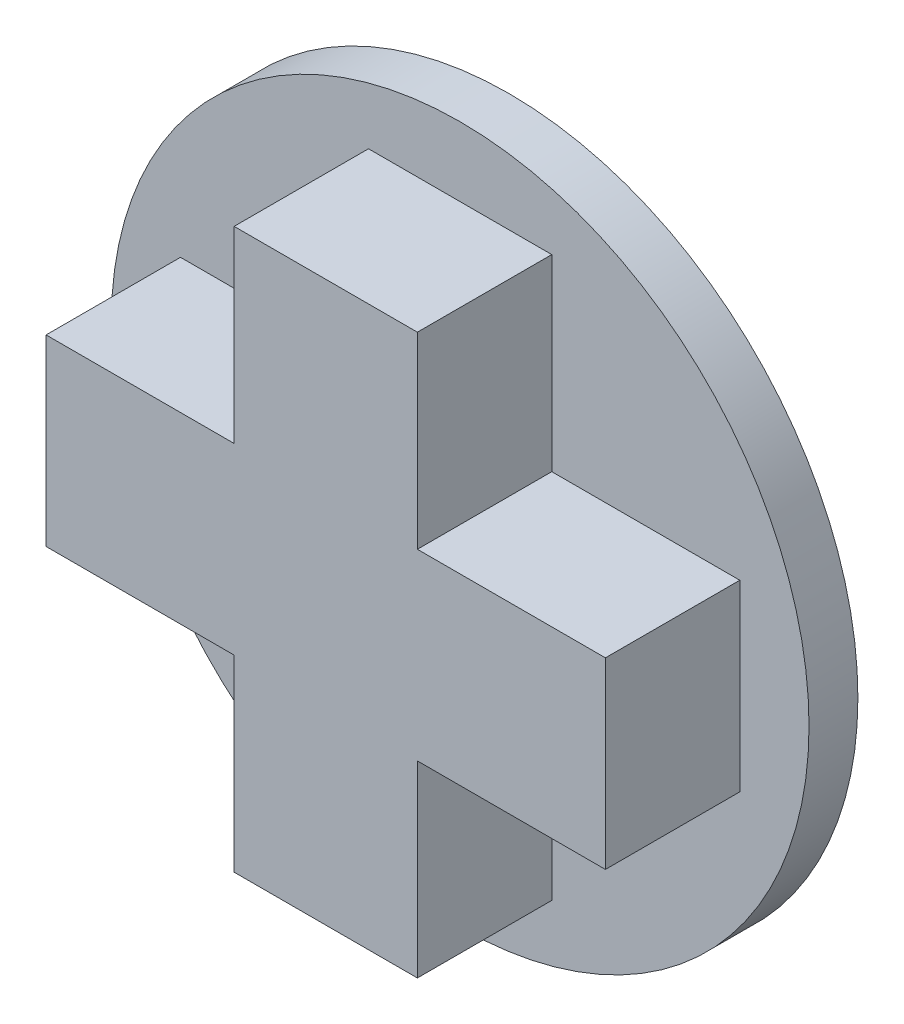
ISO-10303-21;
HEADER;
FILE_DESCRIPTION(('STEP AP214'),'2;1');
FILE_NAME('part.step','',(''),(''),'','','');
FILE_SCHEMA(('AUTOMOTIVE_DESIGN { 1 0 10303 214 1 1 1 1 }'));
ENDSEC;
DATA;
#1=APPLICATION_CONTEXT('core data for automotive mechanical design processes');
#2=APPLICATION_PROTOCOL_DEFINITION('international standard','automotive_design',2000,#1);
#3=PRODUCT_CONTEXT('',#1,'mechanical');
#4=PRODUCT('Part','Part','',(#3));
#5=PRODUCT_RELATED_PRODUCT_CATEGORY('part','',(#4));
#6=PRODUCT_DEFINITION_FORMATION('','',#4);
#7=PRODUCT_DEFINITION_CONTEXT('part definition',#1,'design');
#8=PRODUCT_DEFINITION('design','',#6,#7);
#9=PRODUCT_DEFINITION_SHAPE('','',#8);
#10=(LENGTH_UNIT() NAMED_UNIT(*) SI_UNIT(.MILLI.,.METRE.));
#11=(NAMED_UNIT(*) PLANE_ANGLE_UNIT() SI_UNIT($,.RADIAN.));
#12=(NAMED_UNIT(*) SI_UNIT($,.STERADIAN.) SOLID_ANGLE_UNIT());
#13=UNCERTAINTY_MEASURE_WITH_UNIT(LENGTH_MEASURE(1.E-05),#10,'distance_accuracy_value','');
#14=(GEOMETRIC_REPRESENTATION_CONTEXT(3) GLOBAL_UNCERTAINTY_ASSIGNED_CONTEXT((#13)) GLOBAL_UNIT_ASSIGNED_CONTEXT((#10,
#11,#12)) REPRESENTATION_CONTEXT('',''));
#15=CARTESIAN_POINT('',(0.,0.,0.));
#16=DIRECTION('',(0.,0.,1.));
#17=DIRECTION('',(1.,0.,0.));
#18=AXIS2_PLACEMENT_3D('',#15,#16,#17);
#19=CARTESIAN_POINT('',(0.,0.,1.8));
#20=DIRECTION('',(0.,0.,1.));
#21=DIRECTION('',(1.,0.,0.));
#22=AXIS2_PLACEMENT_3D('',#19,#20,#21);
#23=PLANE('',#22);
#24=CARTESIAN_POINT('',(0.,0.,1.8));
#25=DIRECTION('',(0.,0.,1.));
#26=DIRECTION('',(1.,0.,0.));
#27=AXIS2_PLACEMENT_3D('',#24,#25,#26);
#28=CIRCLE('',#27,12.85);
#29=CARTESIAN_POINT('',(12.85,0.,1.8));
#30=VERTEX_POINT('',#29);
#31=EDGE_CURVE('E204',#30,#30,#28,.T.);
#32=ORIENTED_EDGE('',*,*,#31,.T.);
#33=EDGE_LOOP('',(#32));
#34=FACE_BOUND('',#33,.T.);
#35=DIRECTION('',(-1.,0.,0.));
#36=VECTOR('',#35,1.);
#37=CARTESIAN_POINT('',(-3.375,10.3,1.8));
#38=LINE('',#37,#36);
#39=CARTESIAN_POINT('',(3.375,10.3,1.8));
#40=VERTEX_POINT('',#39);
#41=CARTESIAN_POINT('',(-3.375,10.3,1.8));
#42=VERTEX_POINT('',#41);
#43=EDGE_CURVE('E156',#40,#42,#38,.T.);
#44=ORIENTED_EDGE('',*,*,#43,.F.);
#45=DIRECTION('',(0.,1.,0.));
#46=VECTOR('',#45,1.);
#47=CARTESIAN_POINT('',(3.375,3.375,1.8));
#48=LINE('',#47,#46);
#49=CARTESIAN_POINT('',(3.375,3.375,1.8));
#50=VERTEX_POINT('',#49);
#51=EDGE_CURVE('E153',#50,#40,#48,.T.);
#52=ORIENTED_EDGE('',*,*,#51,.F.);
#53=DIRECTION('',(-1.,0.,0.));
#54=VECTOR('',#53,1.);
#55=CARTESIAN_POINT('',(3.375,3.375,1.8));
#56=LINE('',#55,#54);
#57=CARTESIAN_POINT('',(10.3,3.375,1.8));
#58=VERTEX_POINT('',#57);
#59=EDGE_CURVE('E94',#58,#50,#56,.T.);
#60=ORIENTED_EDGE('',*,*,#59,.F.);
#61=DIRECTION('',(0.,1.,0.));
#62=VECTOR('',#61,1.);
#63=CARTESIAN_POINT('',(10.3,-3.375,1.8));
#64=LINE('',#63,#62);
#65=CARTESIAN_POINT('',(10.3,-3.375,1.8));
#66=VERTEX_POINT('',#65);
#67=EDGE_CURVE('E173',#66,#58,#64,.T.);
#68=ORIENTED_EDGE('',*,*,#67,.F.);
#69=DIRECTION('',(1.,0.,0.));
#70=VECTOR('',#69,1.);
#71=CARTESIAN_POINT('',(3.375,-3.375,1.8));
#72=LINE('',#71,#70);
#73=CARTESIAN_POINT('',(3.375,-3.375,1.8));
#74=VERTEX_POINT('',#73);
#75=EDGE_CURVE('E142',#74,#66,#72,.T.);
#76=ORIENTED_EDGE('',*,*,#75,.F.);
#77=DIRECTION('',(0.,1.,0.));
#78=VECTOR('',#77,1.);
#79=CARTESIAN_POINT('',(3.375,-10.3,1.8));
#80=LINE('',#79,#78);
#81=CARTESIAN_POINT('',(3.375,-10.3,1.8));
#82=VERTEX_POINT('',#81);
#83=EDGE_CURVE('E170',#82,#74,#80,.T.);
#84=ORIENTED_EDGE('',*,*,#83,.F.);
#85=DIRECTION('',(1.,0.,0.));
#86=VECTOR('',#85,1.);
#87=CARTESIAN_POINT('',(-3.375,-10.3,1.8));
#88=LINE('',#87,#86);
#89=CARTESIAN_POINT('',(-3.375,-10.3,1.8));
#90=VERTEX_POINT('',#89);
#91=EDGE_CURVE('E168',#90,#82,#88,.T.);
#92=ORIENTED_EDGE('',*,*,#91,.F.);
#93=DIRECTION('',(0.,-1.,0.));
#94=VECTOR('',#93,1.);
#95=CARTESIAN_POINT('',(-3.375,-10.3,1.8));
#96=LINE('',#95,#94);
#97=CARTESIAN_POINT('',(-3.375,-3.375,1.8));
#98=VERTEX_POINT('',#97);
#99=EDGE_CURVE('E166',#98,#90,#96,.T.);
#100=ORIENTED_EDGE('',*,*,#99,.F.);
#101=DIRECTION('',(1.,0.,0.));
#102=VECTOR('',#101,1.);
#103=CARTESIAN_POINT('',(-10.3,-3.375,1.8));
#104=LINE('',#103,#102);
#105=CARTESIAN_POINT('',(-10.3,-3.375,1.8));
#106=VERTEX_POINT('',#105);
#107=EDGE_CURVE('E164',#106,#98,#104,.T.);
#108=ORIENTED_EDGE('',*,*,#107,.F.);
#109=DIRECTION('',(0.,-1.,0.));
#110=VECTOR('',#109,1.);
#111=CARTESIAN_POINT('',(-10.3,-3.375,1.8));
#112=LINE('',#111,#110);
#113=CARTESIAN_POINT('',(-10.3,3.375,1.8));
#114=VERTEX_POINT('',#113);
#115=EDGE_CURVE('E162',#114,#106,#112,.T.);
#116=ORIENTED_EDGE('',*,*,#115,.F.);
#117=DIRECTION('',(-1.,0.,0.));
#118=VECTOR('',#117,1.);
#119=CARTESIAN_POINT('',(-10.3,3.375,1.8));
#120=LINE('',#119,#118);
#121=CARTESIAN_POINT('',(-3.375,3.375,1.8));
#122=VERTEX_POINT('',#121);
#123=EDGE_CURVE('E160',#122,#114,#120,.T.);
#124=ORIENTED_EDGE('',*,*,#123,.F.);
#125=DIRECTION('',(0.,-1.,0.));
#126=VECTOR('',#125,1.);
#127=CARTESIAN_POINT('',(-3.375,3.375,1.8));
#128=LINE('',#127,#126);
#129=EDGE_CURVE('E158',#42,#122,#128,.T.);
#130=ORIENTED_EDGE('',*,*,#129,.F.);
#131=EDGE_LOOP('',(#44,#52,#60,#68,#76,#84,#92,#100,#108,#116,#124,#130));
#132=FACE_BOUND('',#131,.T.);
#133=ADVANCED_FACE('F33',(#34,#132),#23,.T.);
#134=CARTESIAN_POINT('',(0.,0.,1.8));
#135=DIRECTION('',(0.,0.,-1.));
#136=DIRECTION('',(-1.,0.,0.));
#137=AXIS2_PLACEMENT_3D('',#134,#135,#136);
#138=CYLINDRICAL_SURFACE('',#137,12.85);
#139=ORIENTED_EDGE('',*,*,#31,.F.);
#140=EDGE_LOOP('',(#139));
#141=FACE_BOUND('',#140,.T.);
#142=CARTESIAN_POINT('',(0.,0.,0.));
#143=DIRECTION('',(0.,0.,1.));
#144=DIRECTION('',(1.,0.,0.));
#145=AXIS2_PLACEMENT_3D('',#142,#143,#144);
#146=CIRCLE('',#145,12.85);
#147=CARTESIAN_POINT('',(12.85,0.,0.));
#148=VERTEX_POINT('',#147);
#149=EDGE_CURVE('E203',#148,#148,#146,.T.);
#150=ORIENTED_EDGE('',*,*,#149,.T.);
#151=EDGE_LOOP('',(#150));
#152=FACE_BOUND('',#151,.T.);
#153=ADVANCED_FACE('F225',(#141,#152),#138,.T.);
#154=CARTESIAN_POINT('',(0.,0.,0.));
#155=DIRECTION('',(0.,0.,1.));
#156=DIRECTION('',(1.,0.,0.));
#157=AXIS2_PLACEMENT_3D('',#154,#155,#156);
#158=PLANE('',#157);
#159=CARTESIAN_POINT('',(0.,0.,0.));
#160=DIRECTION('',(0.,0.,1.));
#161=DIRECTION('',(1.,0.,0.));
#162=AXIS2_PLACEMENT_3D('',#159,#160,#161);
#163=CIRCLE('',#162,2.65);
#164=CARTESIAN_POINT('',(2.65,0.,0.));
#165=VERTEX_POINT('',#164);
#166=EDGE_CURVE('E207',#165,#165,#163,.F.);
#167=ORIENTED_EDGE('',*,*,#166,.F.);
#168=EDGE_LOOP('',(#167));
#169=FACE_BOUND('',#168,.T.);
#170=ORIENTED_EDGE('',*,*,#149,.F.);
#171=EDGE_LOOP('',(#170));
#172=FACE_BOUND('',#171,.T.);
#173=ADVANCED_FACE('F231',(#169,#172),#158,.F.);
#174=CARTESIAN_POINT('',(3.375,3.375,6.75));
#175=DIRECTION('',(-1.,0.,0.));
#176=DIRECTION('',(0.,0.,1.));
#177=AXIS2_PLACEMENT_3D('',#174,#175,#176);
#178=PLANE('',#177);
#179=ORIENTED_EDGE('',*,*,#51,.T.);
#180=DIRECTION('',(0.,0.,-1.));
#181=VECTOR('',#180,1.);
#182=CARTESIAN_POINT('',(3.375,10.3,6.75));
#183=LINE('',#182,#181);
#184=CARTESIAN_POINT('',(3.375,10.3,6.75));
#185=VERTEX_POINT('',#184);
#186=EDGE_CURVE('E201',#185,#40,#183,.T.);
#187=ORIENTED_EDGE('',*,*,#186,.F.);
#188=DIRECTION('',(0.,1.,0.));
#189=VECTOR('',#188,1.);
#190=CARTESIAN_POINT('',(3.375,3.375,6.75));
#191=LINE('',#190,#189);
#192=CARTESIAN_POINT('',(3.375,3.375,6.75));
#193=VERTEX_POINT('',#192);
#194=EDGE_CURVE('E176',#193,#185,#191,.T.);
#195=ORIENTED_EDGE('',*,*,#194,.F.);
#196=DIRECTION('',(0.,0.,-1.));
#197=VECTOR('',#196,1.);
#198=CARTESIAN_POINT('',(3.375,3.375,6.75));
#199=LINE('',#198,#197);
#200=EDGE_CURVE('E149',#193,#50,#199,.T.);
#201=ORIENTED_EDGE('',*,*,#200,.T.);
#202=EDGE_LOOP('',(#179,#187,#195,#201));
#203=FACE_BOUND('',#202,.T.);
#204=ADVANCED_FACE('F236',(#203),#178,.F.);
#205=CARTESIAN_POINT('',(-3.375,10.3,6.75));
#206=DIRECTION('',(0.,-1.,0.));
#207=DIRECTION('',(0.,0.,-1.));
#208=AXIS2_PLACEMENT_3D('',#205,#206,#207);
#209=PLANE('',#208);
#210=ORIENTED_EDGE('',*,*,#43,.T.);
#211=DIRECTION('',(0.,0.,-1.));
#212=VECTOR('',#211,1.);
#213=CARTESIAN_POINT('',(-3.375,10.3,6.75));
#214=LINE('',#213,#212);
#215=CARTESIAN_POINT('',(-3.375,10.3,6.75));
#216=VERTEX_POINT('',#215);
#217=EDGE_CURVE('E198',#216,#42,#214,.T.);
#218=ORIENTED_EDGE('',*,*,#217,.F.);
#219=DIRECTION('',(-1.,0.,0.));
#220=VECTOR('',#219,1.);
#221=CARTESIAN_POINT('',(-3.375,10.3,6.75));
#222=LINE('',#221,#220);
#223=EDGE_CURVE('E102',#185,#216,#222,.T.);
#224=ORIENTED_EDGE('',*,*,#223,.F.);
#225=ORIENTED_EDGE('',*,*,#186,.T.);
#226=EDGE_LOOP('',(#210,#218,#224,#225));
#227=FACE_BOUND('',#226,.T.);
#228=ADVANCED_FACE('F243',(#227),#209,.F.);
#229=CARTESIAN_POINT('',(-3.375,3.375,6.75));
#230=DIRECTION('',(1.,0.,0.));
#231=DIRECTION('',(0.,0.,-1.));
#232=AXIS2_PLACEMENT_3D('',#229,#230,#231);
#233=PLANE('',#232);
#234=ORIENTED_EDGE('',*,*,#129,.T.);
#235=DIRECTION('',(0.,0.,-1.));
#236=VECTOR('',#235,1.);
#237=CARTESIAN_POINT('',(-3.375,3.375,6.75));
#238=LINE('',#237,#236);
#239=CARTESIAN_POINT('',(-3.375,3.375,6.75));
#240=VERTEX_POINT('',#239);
#241=EDGE_CURVE('E195',#240,#122,#238,.T.);
#242=ORIENTED_EDGE('',*,*,#241,.F.);
#243=DIRECTION('',(0.,-1.,0.));
#244=VECTOR('',#243,1.);
#245=CARTESIAN_POINT('',(-3.375,3.375,6.75));
#246=LINE('',#245,#244);
#247=EDGE_CURVE('E301',#216,#240,#246,.T.);
#248=ORIENTED_EDGE('',*,*,#247,.F.);
#249=ORIENTED_EDGE('',*,*,#217,.T.);
#250=EDGE_LOOP('',(#234,#242,#248,#249));
#251=FACE_BOUND('',#250,.T.);
#252=ADVANCED_FACE('F288',(#251),#233,.F.);
#253=CARTESIAN_POINT('',(-10.3,3.375,6.75));
#254=DIRECTION('',(0.,-1.,0.));
#255=DIRECTION('',(0.,0.,-1.));
#256=AXIS2_PLACEMENT_3D('',#253,#254,#255);
#257=PLANE('',#256);
#258=ORIENTED_EDGE('',*,*,#123,.T.);
#259=DIRECTION('',(0.,0.,-1.));
#260=VECTOR('',#259,1.);
#261=CARTESIAN_POINT('',(-10.3,3.375,6.75));
#262=LINE('',#261,#260);
#263=CARTESIAN_POINT('',(-10.3,3.375,6.75));
#264=VERTEX_POINT('',#263);
#265=EDGE_CURVE('E192',#264,#114,#262,.T.);
#266=ORIENTED_EDGE('',*,*,#265,.F.);
#267=DIRECTION('',(-1.,0.,0.));
#268=VECTOR('',#267,1.);
#269=CARTESIAN_POINT('',(-10.3,3.375,6.75));
#270=LINE('',#269,#268);
#271=EDGE_CURVE('E312',#240,#264,#270,.T.);
#272=ORIENTED_EDGE('',*,*,#271,.F.);
#273=ORIENTED_EDGE('',*,*,#241,.T.);
#274=EDGE_LOOP('',(#258,#266,#272,#273));
#275=FACE_BOUND('',#274,.T.);
#276=ADVANCED_FACE('F284',(#275),#257,.F.);
#277=CARTESIAN_POINT('',(-10.3,-3.375,6.75));
#278=DIRECTION('',(1.,0.,0.));
#279=DIRECTION('',(0.,0.,-1.));
#280=AXIS2_PLACEMENT_3D('',#277,#278,#279);
#281=PLANE('',#280);
#282=ORIENTED_EDGE('',*,*,#115,.T.);
#283=DIRECTION('',(0.,0.,-1.));
#284=VECTOR('',#283,1.);
#285=CARTESIAN_POINT('',(-10.3,-3.375,6.75));
#286=LINE('',#285,#284);
#287=CARTESIAN_POINT('',(-10.3,-3.375,6.75));
#288=VERTEX_POINT('',#287);
#289=EDGE_CURVE('E189',#288,#106,#286,.T.);
#290=ORIENTED_EDGE('',*,*,#289,.F.);
#291=DIRECTION('',(0.,-1.,0.));
#292=VECTOR('',#291,1.);
#293=CARTESIAN_POINT('',(-10.3,-3.375,6.75));
#294=LINE('',#293,#292);
#295=EDGE_CURVE('E309',#264,#288,#294,.T.);
#296=ORIENTED_EDGE('',*,*,#295,.F.);
#297=ORIENTED_EDGE('',*,*,#265,.T.);
#298=EDGE_LOOP('',(#282,#290,#296,#297));
#299=FACE_BOUND('',#298,.T.);
#300=ADVANCED_FACE('F280',(#299),#281,.F.);
#301=CARTESIAN_POINT('',(-10.3,-3.375,6.75));
#302=DIRECTION('',(0.,1.,0.));
#303=DIRECTION('',(-1.,0.,0.));
#304=AXIS2_PLACEMENT_3D('',#301,#302,#303);
#305=PLANE('',#304);
#306=ORIENTED_EDGE('',*,*,#107,.T.);
#307=DIRECTION('',(0.,0.,-1.));
#308=VECTOR('',#307,1.);
#309=CARTESIAN_POINT('',(-3.375,-3.375,6.75));
#310=LINE('',#309,#308);
#311=CARTESIAN_POINT('',(-3.375,-3.375,6.75));
#312=VERTEX_POINT('',#311);
#313=EDGE_CURVE('E186',#312,#98,#310,.T.);
#314=ORIENTED_EDGE('',*,*,#313,.F.);
#315=DIRECTION('',(1.,0.,0.));
#316=VECTOR('',#315,1.);
#317=CARTESIAN_POINT('',(-10.3,-3.375,6.75));
#318=LINE('',#317,#316);
#319=EDGE_CURVE('E311',#288,#312,#318,.T.);
#320=ORIENTED_EDGE('',*,*,#319,.F.);
#321=ORIENTED_EDGE('',*,*,#289,.T.);
#322=EDGE_LOOP('',(#306,#314,#320,#321));
#323=FACE_BOUND('',#322,.T.);
#324=ADVANCED_FACE('F276',(#323),#305,.F.);
#325=CARTESIAN_POINT('',(-3.375,-10.3,6.75));
#326=DIRECTION('',(1.,0.,0.));
#327=DIRECTION('',(0.,0.,-1.));
#328=AXIS2_PLACEMENT_3D('',#325,#326,#327);
#329=PLANE('',#328);
#330=ORIENTED_EDGE('',*,*,#99,.T.);
#331=DIRECTION('',(0.,0.,-1.));
#332=VECTOR('',#331,1.);
#333=CARTESIAN_POINT('',(-3.375,-10.3,6.75));
#334=LINE('',#333,#332);
#335=CARTESIAN_POINT('',(-3.375,-10.3,6.75));
#336=VERTEX_POINT('',#335);
#337=EDGE_CURVE('E183',#336,#90,#334,.T.);
#338=ORIENTED_EDGE('',*,*,#337,.F.);
#339=DIRECTION('',(0.,-1.,0.));
#340=VECTOR('',#339,1.);
#341=CARTESIAN_POINT('',(-3.375,-10.3,6.75));
#342=LINE('',#341,#340);
#343=EDGE_CURVE('E314',#312,#336,#342,.T.);
#344=ORIENTED_EDGE('',*,*,#343,.F.);
#345=ORIENTED_EDGE('',*,*,#313,.T.);
#346=EDGE_LOOP('',(#330,#338,#344,#345));
#347=FACE_BOUND('',#346,.T.);
#348=ADVANCED_FACE('F272',(#347),#329,.F.);
#349=CARTESIAN_POINT('',(-3.375,-10.3,6.75));
#350=DIRECTION('',(0.,1.,0.));
#351=DIRECTION('',(0.,0.,1.));
#352=AXIS2_PLACEMENT_3D('',#349,#350,#351);
#353=PLANE('',#352);
#354=ORIENTED_EDGE('',*,*,#91,.T.);
#355=DIRECTION('',(0.,0.,-1.));
#356=VECTOR('',#355,1.);
#357=CARTESIAN_POINT('',(3.375,-10.3,6.75));
#358=LINE('',#357,#356);
#359=CARTESIAN_POINT('',(3.375,-10.3,6.75));
#360=VERTEX_POINT('',#359);
#361=EDGE_CURVE('E180',#360,#82,#358,.T.);
#362=ORIENTED_EDGE('',*,*,#361,.F.);
#363=DIRECTION('',(1.,0.,0.));
#364=VECTOR('',#363,1.);
#365=CARTESIAN_POINT('',(-3.375,-10.3,6.75));
#366=LINE('',#365,#364);
#367=EDGE_CURVE('E320',#336,#360,#366,.T.);
#368=ORIENTED_EDGE('',*,*,#367,.F.);
#369=ORIENTED_EDGE('',*,*,#337,.T.);
#370=EDGE_LOOP('',(#354,#362,#368,#369));
#371=FACE_BOUND('',#370,.T.);
#372=ADVANCED_FACE('F268',(#371),#353,.F.);
#373=CARTESIAN_POINT('',(3.375,-10.3,6.75));
#374=DIRECTION('',(-1.,0.,0.));
#375=DIRECTION('',(0.,0.,1.));
#376=AXIS2_PLACEMENT_3D('',#373,#374,#375);
#377=PLANE('',#376);
#378=ORIENTED_EDGE('',*,*,#83,.T.);
#379=DIRECTION('',(0.,0.,-1.));
#380=VECTOR('',#379,1.);
#381=CARTESIAN_POINT('',(3.375,-3.375,6.75));
#382=LINE('',#381,#380);
#383=CARTESIAN_POINT('',(3.375,-3.375,6.75));
#384=VERTEX_POINT('',#383);
#385=EDGE_CURVE('E145',#384,#74,#382,.T.);
#386=ORIENTED_EDGE('',*,*,#385,.F.);
#387=DIRECTION('',(0.,1.,0.));
#388=VECTOR('',#387,1.);
#389=CARTESIAN_POINT('',(3.375,-10.3,6.75));
#390=LINE('',#389,#388);
#391=EDGE_CURVE('E133',#360,#384,#390,.T.);
#392=ORIENTED_EDGE('',*,*,#391,.F.);
#393=ORIENTED_EDGE('',*,*,#361,.T.);
#394=EDGE_LOOP('',(#378,#386,#392,#393));
#395=FACE_BOUND('',#394,.T.);
#396=ADVANCED_FACE('F265',(#395),#377,.F.);
#397=CARTESIAN_POINT('',(3.375,-3.375,6.75));
#398=DIRECTION('',(0.,1.,0.));
#399=DIRECTION('',(-1.,0.,0.));
#400=AXIS2_PLACEMENT_3D('',#397,#398,#399);
#401=PLANE('',#400);
#402=ORIENTED_EDGE('',*,*,#75,.T.);
#403=DIRECTION('',(0.,0.,-1.));
#404=VECTOR('',#403,1.);
#405=CARTESIAN_POINT('',(10.3,-3.375,6.75));
#406=LINE('',#405,#404);
#407=CARTESIAN_POINT('',(10.3,-3.375,6.75));
#408=VERTEX_POINT('',#407);
#409=EDGE_CURVE('E139',#408,#66,#406,.T.);
#410=ORIENTED_EDGE('',*,*,#409,.F.);
#411=DIRECTION('',(1.,0.,0.));
#412=VECTOR('',#411,1.);
#413=CARTESIAN_POINT('',(3.375,-3.375,6.75));
#414=LINE('',#413,#412);
#415=EDGE_CURVE('E127',#384,#408,#414,.T.);
#416=ORIENTED_EDGE('',*,*,#415,.F.);
#417=ORIENTED_EDGE('',*,*,#385,.T.);
#418=EDGE_LOOP('',(#402,#410,#416,#417));
#419=FACE_BOUND('',#418,.T.);
#420=ADVANCED_FACE('F140',(#419),#401,.F.);
#421=CARTESIAN_POINT('',(10.3,-3.375,6.75));
#422=DIRECTION('',(-1.,0.,0.));
#423=DIRECTION('',(0.,0.,1.));
#424=AXIS2_PLACEMENT_3D('',#421,#422,#423);
#425=PLANE('',#424);
#426=ORIENTED_EDGE('',*,*,#67,.T.);
#427=DIRECTION('',(0.,0.,-1.));
#428=VECTOR('',#427,1.);
#429=CARTESIAN_POINT('',(10.3,3.375,6.75));
#430=LINE('',#429,#428);
#431=CARTESIAN_POINT('',(10.3,3.375,6.75));
#432=VERTEX_POINT('',#431);
#433=EDGE_CURVE('E48',#432,#58,#430,.T.);
#434=ORIENTED_EDGE('',*,*,#433,.F.);
#435=DIRECTION('',(0.,1.,0.));
#436=VECTOR('',#435,1.);
#437=CARTESIAN_POINT('',(10.3,-3.375,6.75));
#438=LINE('',#437,#436);
#439=EDGE_CURVE('E131',#408,#432,#438,.T.);
#440=ORIENTED_EDGE('',*,*,#439,.F.);
#441=ORIENTED_EDGE('',*,*,#409,.T.);
#442=EDGE_LOOP('',(#426,#434,#440,#441));
#443=FACE_BOUND('',#442,.T.);
#444=ADVANCED_FACE('F147',(#443),#425,.F.);
#445=CARTESIAN_POINT('',(3.375,3.375,6.75));
#446=DIRECTION('',(0.,-1.,0.));
#447=DIRECTION('',(0.,0.,-1.));
#448=AXIS2_PLACEMENT_3D('',#445,#446,#447);
#449=PLANE('',#448);
#450=ORIENTED_EDGE('',*,*,#59,.T.);
#451=ORIENTED_EDGE('',*,*,#200,.F.);
#452=DIRECTION('',(-1.,0.,0.));
#453=VECTOR('',#452,1.);
#454=CARTESIAN_POINT('',(3.375,3.375,6.75));
#455=LINE('',#454,#453);
#456=EDGE_CURVE('E56',#432,#193,#455,.T.);
#457=ORIENTED_EDGE('',*,*,#456,.F.);
#458=ORIENTED_EDGE('',*,*,#433,.T.);
#459=EDGE_LOOP('',(#450,#451,#457,#458));
#460=FACE_BOUND('',#459,.T.);
#461=ADVANCED_FACE('F256',(#460),#449,.F.);
#462=CARTESIAN_POINT('',(0.,0.,6.75));
#463=DIRECTION('',(0.,0.,-1.));
#464=DIRECTION('',(-1.,0.,0.));
#465=AXIS2_PLACEMENT_3D('',#462,#463,#464);
#466=PLANE('',#465);
#467=ORIENTED_EDGE('',*,*,#194,.T.);
#468=ORIENTED_EDGE('',*,*,#223,.T.);
#469=ORIENTED_EDGE('',*,*,#247,.T.);
#470=ORIENTED_EDGE('',*,*,#271,.T.);
#471=ORIENTED_EDGE('',*,*,#295,.T.);
#472=ORIENTED_EDGE('',*,*,#319,.T.);
#473=ORIENTED_EDGE('',*,*,#343,.T.);
#474=ORIENTED_EDGE('',*,*,#367,.T.);
#475=ORIENTED_EDGE('',*,*,#391,.T.);
#476=ORIENTED_EDGE('',*,*,#415,.T.);
#477=ORIENTED_EDGE('',*,*,#439,.T.);
#478=ORIENTED_EDGE('',*,*,#456,.T.);
#479=EDGE_LOOP('',(#467,#468,#469,#470,#471,#472,#473,#474,#475,#476,#477,#478));
#480=FACE_BOUND('',#479,.T.);
#481=ADVANCED_FACE('F129',(#480),#466,.F.);
#482=CARTESIAN_POINT('',(0.,0.,-2.5));
#483=DIRECTION('',(0.,0.,1.));
#484=DIRECTION('',(1.,0.,0.));
#485=AXIS2_PLACEMENT_3D('',#482,#483,#484);
#486=CYLINDRICAL_SURFACE('',#485,2.65);
#487=CARTESIAN_POINT('',(0.,0.,-1.25));
#488=DIRECTION('',(0.,0.,-1.));
#489=DIRECTION('',(-1.,0.,0.));
#490=AXIS2_PLACEMENT_3D('',#487,#488,#489);
#491=CIRCLE('',#490,2.65);
#492=CARTESIAN_POINT('',(-2.65,0.,-1.25));
#493=VERTEX_POINT('',#492);
#494=EDGE_CURVE('E11',#493,#493,#491,.F.);
#495=ORIENTED_EDGE('',*,*,#494,.T.);
#496=EDGE_LOOP('',(#495));
#497=FACE_BOUND('',#496,.T.);
#498=ORIENTED_EDGE('',*,*,#166,.T.);
#499=EDGE_LOOP('',(#498));
#500=FACE_BOUND('',#499,.T.);
#501=ADVANCED_FACE('F221',(#497,#500),#486,.T.);
#502=CARTESIAN_POINT('',(0.,0.,-2.5));
#503=DIRECTION('',(0.,0.,-1.));
#504=DIRECTION('',(-1.,0.,0.));
#505=AXIS2_PLACEMENT_3D('',#502,#503,#504);
#506=PLANE('',#505);
#507=CARTESIAN_POINT('',(0.,0.,-2.5));
#508=DIRECTION('',(0.,0.,-1.));
#509=DIRECTION('',(-1.,0.,0.));
#510=AXIS2_PLACEMENT_3D('',#507,#508,#509);
#511=CIRCLE('',#510,1.4);
#512=CARTESIAN_POINT('',(-1.4,0.,-2.5));
#513=VERTEX_POINT('',#512);
#514=EDGE_CURVE('E41',#513,#513,#511,.T.);
#515=ORIENTED_EDGE('',*,*,#514,.T.);
#516=EDGE_LOOP('',(#515));
#517=FACE_BOUND('',#516,.T.);
#518=ADVANCED_FACE('F214',(#517),#506,.T.);
#519=CARTESIAN_POINT('',(0.,0.,-1.25));
#520=DIRECTION('',(0.,0.,-1.));
#521=DIRECTION('',(-1.,0.,0.));
#522=AXIS2_PLACEMENT_3D('',#519,#520,#521);
#523=TOROIDAL_SURFACE('',#522,1.4,1.25);
#524=ORIENTED_EDGE('',*,*,#494,.F.);
#525=EDGE_LOOP('',(#524));
#526=FACE_BOUND('',#525,.T.);
#527=ORIENTED_EDGE('',*,*,#514,.F.);
#528=EDGE_LOOP('',(#527));
#529=FACE_BOUND('',#528,.T.);
#530=ADVANCED_FACE('F35',(#526,#529),#523,.T.);
#531=CLOSED_SHELL('',(#133,#153,#173,#204,#228,#252,#276,#300,#324,#348,#372,#396,#420,#444,
#461,#481,#501,#518,#530));
#532=MANIFOLD_SOLID_BREP('B2',#531);
#533=ADVANCED_BREP_SHAPE_REPRESENTATION('',(#18,#532),#14);
#534=SHAPE_DEFINITION_REPRESENTATION(#9,#533);
ENDSEC;
END-ISO-10303-21;
